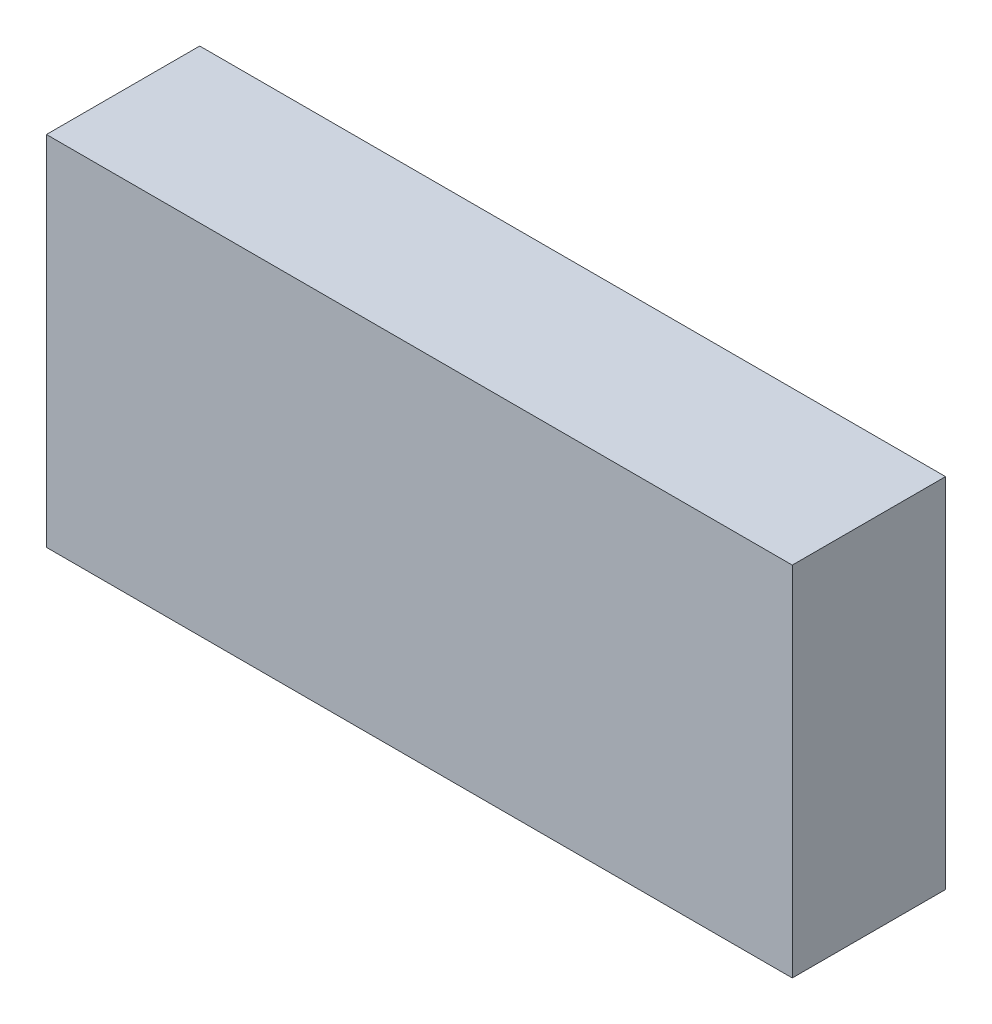
ISO-10303-21;
HEADER;
FILE_DESCRIPTION(('STEP AP214'),'2;1');
FILE_NAME('part.step','',(''),(''),'','','');
FILE_SCHEMA(('AUTOMOTIVE_DESIGN { 1 0 10303 214 1 1 1 1 }'));
ENDSEC;
DATA;
#1=APPLICATION_CONTEXT('core data for automotive mechanical design processes');
#2=APPLICATION_PROTOCOL_DEFINITION('international standard','automotive_design',2000,#1);
#3=PRODUCT_CONTEXT('',#1,'mechanical');
#4=PRODUCT('Part','Part','',(#3));
#5=PRODUCT_RELATED_PRODUCT_CATEGORY('part','',(#4));
#6=PRODUCT_DEFINITION_FORMATION('','',#4);
#7=PRODUCT_DEFINITION_CONTEXT('part definition',#1,'design');
#8=PRODUCT_DEFINITION('design','',#6,#7);
#9=PRODUCT_DEFINITION_SHAPE('','',#8);
#10=(LENGTH_UNIT() NAMED_UNIT(*) SI_UNIT(.MILLI.,.METRE.));
#11=(NAMED_UNIT(*) PLANE_ANGLE_UNIT() SI_UNIT($,.RADIAN.));
#12=(NAMED_UNIT(*) SI_UNIT($,.STERADIAN.) SOLID_ANGLE_UNIT());
#13=UNCERTAINTY_MEASURE_WITH_UNIT(LENGTH_MEASURE(1.E-05),#10,'distance_accuracy_value','');
#14=(GEOMETRIC_REPRESENTATION_CONTEXT(3) GLOBAL_UNCERTAINTY_ASSIGNED_CONTEXT((#13)) GLOBAL_UNIT_ASSIGNED_CONTEXT((#10,
#11,#12)) REPRESENTATION_CONTEXT('',''));
#15=CARTESIAN_POINT('',(0.,0.,0.));
#16=DIRECTION('',(0.,0.,1.));
#17=DIRECTION('',(1.,0.,0.));
#18=AXIS2_PLACEMENT_3D('',#15,#16,#17);
#19=CARTESIAN_POINT('',(36.5,17.5,15.));
#20=DIRECTION('',(-1.,0.,0.));
#21=DIRECTION('',(0.,-1.,0.));
#22=AXIS2_PLACEMENT_3D('',#19,#20,#21);
#23=PLANE('',#22);
#24=DIRECTION('',(0.,1.,0.));
#25=VECTOR('',#24,1.);
#26=CARTESIAN_POINT('',(36.5,17.5,0.));
#27=LINE('',#26,#25);
#28=CARTESIAN_POINT('',(36.5,-17.5,0.));
#29=VERTEX_POINT('',#28);
#30=CARTESIAN_POINT('',(36.5,17.5,0.));
#31=VERTEX_POINT('',#30);
#32=EDGE_CURVE('E96',#29,#31,#27,.T.);
#33=ORIENTED_EDGE('',*,*,#32,.T.);
#34=DIRECTION('',(0.,0.,-1.));
#35=VECTOR('',#34,1.);
#36=CARTESIAN_POINT('',(36.5,17.5,15.));
#37=LINE('',#36,#35);
#38=CARTESIAN_POINT('',(36.5,17.5,15.));
#39=VERTEX_POINT('',#38);
#40=EDGE_CURVE('E11',#39,#31,#37,.T.);
#41=ORIENTED_EDGE('',*,*,#40,.F.);
#42=DIRECTION('',(0.,1.,0.));
#43=VECTOR('',#42,1.);
#44=CARTESIAN_POINT('',(36.5,17.5,15.));
#45=LINE('',#44,#43);
#46=CARTESIAN_POINT('',(36.5,-17.5,15.));
#47=VERTEX_POINT('',#46);
#48=EDGE_CURVE('E84',#47,#39,#45,.T.);
#49=ORIENTED_EDGE('',*,*,#48,.F.);
#50=DIRECTION('',(0.,0.,-1.));
#51=VECTOR('',#50,1.);
#52=CARTESIAN_POINT('',(36.5,-17.5,15.));
#53=LINE('',#52,#51);
#54=EDGE_CURVE('E92',#47,#29,#53,.T.);
#55=ORIENTED_EDGE('',*,*,#54,.T.);
#56=EDGE_LOOP('',(#33,#41,#49,#55));
#57=FACE_BOUND('',#56,.T.);
#58=ADVANCED_FACE('F33',(#57),#23,.F.);
#59=CARTESIAN_POINT('',(-36.5,17.5,15.));
#60=DIRECTION('',(0.,-1.,0.));
#61=DIRECTION('',(0.,0.,-1.));
#62=AXIS2_PLACEMENT_3D('',#59,#60,#61);
#63=PLANE('',#62);
#64=DIRECTION('',(-1.,0.,0.));
#65=VECTOR('',#64,1.);
#66=CARTESIAN_POINT('',(-36.5,17.5,0.));
#67=LINE('',#66,#65);
#68=CARTESIAN_POINT('',(-36.5,17.5,0.));
#69=VERTEX_POINT('',#68);
#70=EDGE_CURVE('E88',#31,#69,#67,.T.);
#71=ORIENTED_EDGE('',*,*,#70,.T.);
#72=DIRECTION('',(0.,0.,-1.));
#73=VECTOR('',#72,1.);
#74=CARTESIAN_POINT('',(-36.5,17.5,15.));
#75=LINE('',#74,#73);
#76=CARTESIAN_POINT('',(-36.5,17.5,15.));
#77=VERTEX_POINT('',#76);
#78=EDGE_CURVE('E41',#77,#69,#75,.T.);
#79=ORIENTED_EDGE('',*,*,#78,.F.);
#80=DIRECTION('',(-1.,0.,0.));
#81=VECTOR('',#80,1.);
#82=CARTESIAN_POINT('',(-36.5,17.5,15.));
#83=LINE('',#82,#81);
#84=EDGE_CURVE('E79',#39,#77,#83,.T.);
#85=ORIENTED_EDGE('',*,*,#84,.F.);
#86=ORIENTED_EDGE('',*,*,#40,.T.);
#87=EDGE_LOOP('',(#71,#79,#85,#86));
#88=FACE_BOUND('',#87,.T.);
#89=ADVANCED_FACE('F87',(#88),#63,.F.);
#90=CARTESIAN_POINT('',(-36.5,17.5,15.));
#91=DIRECTION('',(1.,0.,0.));
#92=DIRECTION('',(0.,0.,-1.));
#93=AXIS2_PLACEMENT_3D('',#90,#91,#92);
#94=PLANE('',#93);
#95=DIRECTION('',(0.,-1.,0.));
#96=VECTOR('',#95,1.);
#97=CARTESIAN_POINT('',(-36.5,17.5,0.));
#98=LINE('',#97,#96);
#99=CARTESIAN_POINT('',(-36.5,-17.5,0.));
#100=VERTEX_POINT('',#99);
#101=EDGE_CURVE('E66',#69,#100,#98,.T.);
#102=ORIENTED_EDGE('',*,*,#101,.T.);
#103=DIRECTION('',(0.,0.,-1.));
#104=VECTOR('',#103,1.);
#105=CARTESIAN_POINT('',(-36.5,-17.5,15.));
#106=LINE('',#105,#104);
#107=CARTESIAN_POINT('',(-36.5,-17.5,15.));
#108=VERTEX_POINT('',#107);
#109=EDGE_CURVE('E89',#108,#100,#106,.T.);
#110=ORIENTED_EDGE('',*,*,#109,.F.);
#111=DIRECTION('',(0.,-1.,0.));
#112=VECTOR('',#111,1.);
#113=CARTESIAN_POINT('',(-36.5,17.5,15.));
#114=LINE('',#113,#112);
#115=EDGE_CURVE('E82',#77,#108,#114,.T.);
#116=ORIENTED_EDGE('',*,*,#115,.F.);
#117=ORIENTED_EDGE('',*,*,#78,.T.);
#118=EDGE_LOOP('',(#102,#110,#116,#117));
#119=FACE_BOUND('',#118,.T.);
#120=ADVANCED_FACE('F90',(#119),#94,.F.);
#121=CARTESIAN_POINT('',(-36.5,-17.5,15.));
#122=DIRECTION('',(0.,1.,0.));
#123=DIRECTION('',(0.,0.,1.));
#124=AXIS2_PLACEMENT_3D('',#121,#122,#123);
#125=PLANE('',#124);
#126=DIRECTION('',(1.,0.,0.));
#127=VECTOR('',#126,1.);
#128=CARTESIAN_POINT('',(-36.5,-17.5,0.));
#129=LINE('',#128,#127);
#130=EDGE_CURVE('E72',#100,#29,#129,.T.);
#131=ORIENTED_EDGE('',*,*,#130,.T.);
#132=ORIENTED_EDGE('',*,*,#54,.F.);
#133=DIRECTION('',(1.,0.,0.));
#134=VECTOR('',#133,1.);
#135=CARTESIAN_POINT('',(-36.5,-17.5,15.));
#136=LINE('',#135,#134);
#137=EDGE_CURVE('E49',#108,#47,#136,.T.);
#138=ORIENTED_EDGE('',*,*,#137,.F.);
#139=ORIENTED_EDGE('',*,*,#109,.T.);
#140=EDGE_LOOP('',(#131,#132,#138,#139));
#141=FACE_BOUND('',#140,.T.);
#142=ADVANCED_FACE('F103',(#141),#125,.F.);
#143=CARTESIAN_POINT('',(0.,0.,15.));
#144=DIRECTION('',(0.,0.,1.));
#145=DIRECTION('',(1.,0.,0.));
#146=AXIS2_PLACEMENT_3D('',#143,#144,#145);
#147=PLANE('',#146);
#148=ORIENTED_EDGE('',*,*,#48,.T.);
#149=ORIENTED_EDGE('',*,*,#84,.T.);
#150=ORIENTED_EDGE('',*,*,#115,.T.);
#151=ORIENTED_EDGE('',*,*,#137,.T.);
#152=EDGE_LOOP('',(#148,#149,#150,#151));
#153=FACE_BOUND('',#152,.T.);
#154=ADVANCED_FACE('F80',(#153),#147,.T.);
#155=CARTESIAN_POINT('',(0.,0.,0.));
#156=DIRECTION('',(0.,0.,1.));
#157=DIRECTION('',(1.,0.,0.));
#158=AXIS2_PLACEMENT_3D('',#155,#156,#157);
#159=PLANE('',#158);
#160=ORIENTED_EDGE('',*,*,#32,.F.);
#161=ORIENTED_EDGE('',*,*,#130,.F.);
#162=ORIENTED_EDGE('',*,*,#101,.F.);
#163=ORIENTED_EDGE('',*,*,#70,.F.);
#164=EDGE_LOOP('',(#160,#161,#162,#163));
#165=FACE_BOUND('',#164,.T.);
#166=ADVANCED_FACE('F106',(#165),#159,.F.);
#167=CLOSED_SHELL('',(#58,#89,#120,#142,#154,#166));
#168=MANIFOLD_SOLID_BREP('B2',#167);
#169=ADVANCED_BREP_SHAPE_REPRESENTATION('',(#18,#168),#14);
#170=SHAPE_DEFINITION_REPRESENTATION(#9,#169);
ENDSEC;
END-ISO-10303-21;
